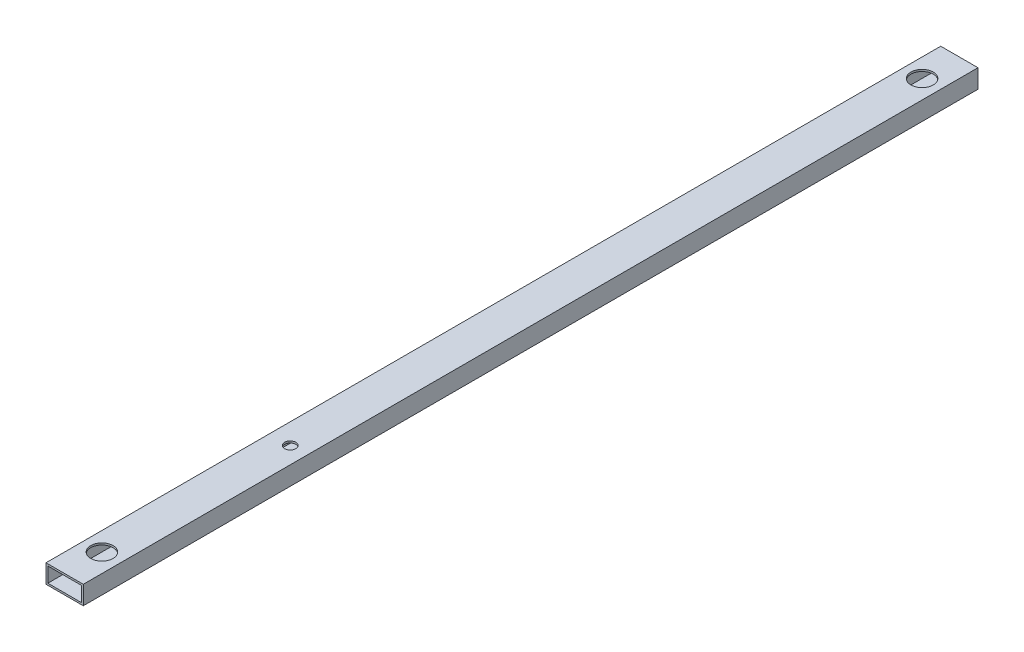
ISO-10303-21;
HEADER;
FILE_DESCRIPTION(('STEP AP214'),'2;1');
FILE_NAME('part.step','',(''),(''),'','','');
FILE_SCHEMA(('AUTOMOTIVE_DESIGN { 1 0 10303 214 1 1 1 1 }'));
ENDSEC;
DATA;
#1=APPLICATION_CONTEXT('core data for automotive mechanical design processes');
#2=APPLICATION_PROTOCOL_DEFINITION('international standard','automotive_design',2000,#1);
#3=PRODUCT_CONTEXT('',#1,'mechanical');
#4=PRODUCT('Part','Part','',(#3));
#5=PRODUCT_RELATED_PRODUCT_CATEGORY('part','',(#4));
#6=PRODUCT_DEFINITION_FORMATION('','',#4);
#7=PRODUCT_DEFINITION_CONTEXT('part definition',#1,'design');
#8=PRODUCT_DEFINITION('design','',#6,#7);
#9=PRODUCT_DEFINITION_SHAPE('','',#8);
#10=(LENGTH_UNIT() NAMED_UNIT(*) SI_UNIT(.MILLI.,.METRE.));
#11=(NAMED_UNIT(*) PLANE_ANGLE_UNIT() SI_UNIT($,.RADIAN.));
#12=(NAMED_UNIT(*) SI_UNIT($,.STERADIAN.) SOLID_ANGLE_UNIT());
#13=UNCERTAINTY_MEASURE_WITH_UNIT(LENGTH_MEASURE(1.E-05),#10,'distance_accuracy_value','');
#14=(GEOMETRIC_REPRESENTATION_CONTEXT(3) GLOBAL_UNCERTAINTY_ASSIGNED_CONTEXT((#13)) GLOBAL_UNIT_ASSIGNED_CONTEXT((#10,
#11,#12)) REPRESENTATION_CONTEXT('',''));
#15=CARTESIAN_POINT('',(0.,0.,0.));
#16=DIRECTION('',(0.,0.,1.));
#17=DIRECTION('',(1.,0.,0.));
#18=AXIS2_PLACEMENT_3D('',#15,#16,#17);
#19=CARTESIAN_POINT('',(-21.7338036512467,14.3817204301075,1200.));
#20=DIRECTION('',(1.,0.,0.));
#21=DIRECTION('',(0.,1.,0.));
#22=AXIS2_PLACEMENT_3D('',#19,#20,#21);
#23=PLANE('',#22);
#24=DIRECTION('',(0.,-1.,0.));
#25=VECTOR('',#24,1.);
#26=CARTESIAN_POINT('',(-21.7338036512467,14.3817204301075,0.));
#27=LINE('',#26,#25);
#28=CARTESIAN_POINT('',(-21.7338036512467,14.3817204301075,0.));
#29=VERTEX_POINT('',#28);
#30=CARTESIAN_POINT('',(-21.7338036512467,-10.6182795698925,0.));
#31=VERTEX_POINT('',#30);
#32=EDGE_CURVE('E144',#29,#31,#27,.T.);
#33=ORIENTED_EDGE('',*,*,#32,.T.);
#34=DIRECTION('',(0.,0.,-1.));
#35=VECTOR('',#34,1.);
#36=CARTESIAN_POINT('',(-21.7338036512467,-10.6182795698925,1200.));
#37=LINE('',#36,#35);
#38=CARTESIAN_POINT('',(-21.7338036512467,-10.6182795698925,1200.));
#39=VERTEX_POINT('',#38);
#40=EDGE_CURVE('E11',#39,#31,#37,.T.);
#41=ORIENTED_EDGE('',*,*,#40,.F.);
#42=DIRECTION('',(0.,-1.,0.));
#43=VECTOR('',#42,1.);
#44=CARTESIAN_POINT('',(-21.7338036512467,14.3817204301075,1200.));
#45=LINE('',#44,#43);
#46=CARTESIAN_POINT('',(-21.7338036512467,14.3817204301075,1200.));
#47=VERTEX_POINT('',#46);
#48=EDGE_CURVE('E133',#47,#39,#45,.T.);
#49=ORIENTED_EDGE('',*,*,#48,.F.);
#50=DIRECTION('',(0.,0.,-1.));
#51=VECTOR('',#50,1.);
#52=CARTESIAN_POINT('',(-21.7338036512467,14.3817204301075,1200.));
#53=LINE('',#52,#51);
#54=EDGE_CURVE('E143',#47,#29,#53,.T.);
#55=ORIENTED_EDGE('',*,*,#54,.T.);
#56=EDGE_LOOP('',(#33,#41,#49,#55));
#57=FACE_BOUND('',#56,.T.);
#58=ADVANCED_FACE('F33',(#57),#23,.F.);
#59=CARTESIAN_POINT('',(-21.7338036512467,-10.6182795698925,1200.));
#60=DIRECTION('',(0.,1.,0.));
#61=DIRECTION('',(0.,0.,1.));
#62=AXIS2_PLACEMENT_3D('',#59,#60,#61);
#63=PLANE('',#62);
#64=CARTESIAN_POINT('',(3.26619634876482,-10.6182795698925,1150.));
#65=DIRECTION('',(0.,1.,0.));
#66=DIRECTION('',(0.,0.,1.));
#67=AXIS2_PLACEMENT_3D('',#64,#65,#66);
#68=CIRCLE('',#67,15.00115);
#69=CARTESIAN_POINT('',(3.26619634876482,-10.6182795698925,1165.00115));
#70=VERTEX_POINT('',#69);
#71=EDGE_CURVE('E264',#70,#70,#68,.T.);
#72=ORIENTED_EDGE('',*,*,#71,.T.);
#73=EDGE_LOOP('',(#72));
#74=FACE_BOUND('',#73,.T.);
#75=CARTESIAN_POINT('',(3.2661963487533,-10.6182795698925,50.));
#76=DIRECTION('',(0.,1.,0.));
#77=DIRECTION('',(0.,0.,1.));
#78=AXIS2_PLACEMENT_3D('',#75,#76,#77);
#79=CIRCLE('',#78,15.00115);
#80=CARTESIAN_POINT('',(3.2661963487533,-10.6182795698925,65.00115));
#81=VERTEX_POINT('',#80);
#82=EDGE_CURVE('E165',#81,#81,#79,.T.);
#83=ORIENTED_EDGE('',*,*,#82,.T.);
#84=EDGE_LOOP('',(#83));
#85=FACE_BOUND('',#84,.T.);
#86=CARTESIAN_POINT('',(5.7661963487533,-10.6182795698925,900.));
#87=DIRECTION('',(0.,1.,0.));
#88=DIRECTION('',(0.,0.,1.));
#89=AXIS2_PLACEMENT_3D('',#86,#87,#88);
#90=CIRCLE('',#89,7.49999999999998);
#91=CARTESIAN_POINT('',(5.7661963487533,-10.6182795698925,907.5));
#92=VERTEX_POINT('',#91);
#93=EDGE_CURVE('E169',#92,#92,#90,.T.);
#94=ORIENTED_EDGE('',*,*,#93,.T.);
#95=EDGE_LOOP('',(#94));
#96=FACE_BOUND('',#95,.T.);
#97=DIRECTION('',(1.,0.,0.));
#98=VECTOR('',#97,1.);
#99=CARTESIAN_POINT('',(-21.7338036512467,-10.6182795698925,0.));
#100=LINE('',#99,#98);
#101=CARTESIAN_POINT('',(28.2661963487533,-10.6182795698925,0.));
#102=VERTEX_POINT('',#101);
#103=EDGE_CURVE('E147',#31,#102,#100,.T.);
#104=ORIENTED_EDGE('',*,*,#103,.T.);
#105=DIRECTION('',(0.,0.,-1.));
#106=VECTOR('',#105,1.);
#107=CARTESIAN_POINT('',(28.2661963487533,-10.6182795698925,1200.));
#108=LINE('',#107,#106);
#109=CARTESIAN_POINT('',(28.2661963487533,-10.6182795698925,1200.));
#110=VERTEX_POINT('',#109);
#111=EDGE_CURVE('E41',#110,#102,#108,.T.);
#112=ORIENTED_EDGE('',*,*,#111,.F.);
#113=DIRECTION('',(1.,0.,0.));
#114=VECTOR('',#113,1.);
#115=CARTESIAN_POINT('',(-21.7338036512467,-10.6182795698925,1200.));
#116=LINE('',#115,#114);
#117=EDGE_CURVE('E136',#39,#110,#116,.T.);
#118=ORIENTED_EDGE('',*,*,#117,.F.);
#119=ORIENTED_EDGE('',*,*,#40,.T.);
#120=EDGE_LOOP('',(#104,#112,#118,#119));
#121=FACE_BOUND('',#120,.T.);
#122=ADVANCED_FACE('F212',(#74,#85,#96,#121),#63,.F.);
#123=CARTESIAN_POINT('',(28.2661963487533,14.3817204301075,1200.));
#124=DIRECTION('',(-1.,0.,0.));
#125=DIRECTION('',(0.,0.,1.));
#126=AXIS2_PLACEMENT_3D('',#123,#124,#125);
#127=PLANE('',#126);
#128=DIRECTION('',(0.,1.,0.));
#129=VECTOR('',#128,1.);
#130=CARTESIAN_POINT('',(28.2661963487533,14.3817204301075,0.));
#131=LINE('',#130,#129);
#132=CARTESIAN_POINT('',(28.2661963487533,14.3817204301075,0.));
#133=VERTEX_POINT('',#132);
#134=EDGE_CURVE('E149',#102,#133,#131,.T.);
#135=ORIENTED_EDGE('',*,*,#134,.T.);
#136=DIRECTION('',(0.,0.,-1.));
#137=VECTOR('',#136,1.);
#138=CARTESIAN_POINT('',(28.2661963487533,14.3817204301075,1200.));
#139=LINE('',#138,#137);
#140=CARTESIAN_POINT('',(28.2661963487533,14.3817204301075,1200.));
#141=VERTEX_POINT('',#140);
#142=EDGE_CURVE('E154',#141,#133,#139,.T.);
#143=ORIENTED_EDGE('',*,*,#142,.F.);
#144=DIRECTION('',(0.,1.,0.));
#145=VECTOR('',#144,1.);
#146=CARTESIAN_POINT('',(28.2661963487533,14.3817204301075,1200.));
#147=LINE('',#146,#145);
#148=EDGE_CURVE('E139',#110,#141,#147,.T.);
#149=ORIENTED_EDGE('',*,*,#148,.F.);
#150=ORIENTED_EDGE('',*,*,#111,.T.);
#151=EDGE_LOOP('',(#135,#143,#149,#150));
#152=FACE_BOUND('',#151,.T.);
#153=ADVANCED_FACE('F218',(#152),#127,.F.);
#154=CARTESIAN_POINT('',(-21.7338036512467,14.3817204301075,1200.));
#155=DIRECTION('',(0.,-1.,0.));
#156=DIRECTION('',(0.,0.,-1.));
#157=AXIS2_PLACEMENT_3D('',#154,#155,#156);
#158=PLANE('',#157);
#159=CARTESIAN_POINT('',(3.26619634876482,14.3817204301075,1150.));
#160=DIRECTION('',(0.,1.,0.));
#161=DIRECTION('',(0.,0.,1.));
#162=AXIS2_PLACEMENT_3D('',#159,#160,#161);
#163=CIRCLE('',#162,15.00115);
#164=CARTESIAN_POINT('',(3.26619634876482,14.3817204301075,1165.00115));
#165=VERTEX_POINT('',#164);
#166=EDGE_CURVE('E267',#165,#165,#163,.T.);
#167=ORIENTED_EDGE('',*,*,#166,.F.);
#168=EDGE_LOOP('',(#167));
#169=FACE_BOUND('',#168,.T.);
#170=CARTESIAN_POINT('',(3.2661963487533,14.3817204301075,50.));
#171=DIRECTION('',(0.,1.,0.));
#172=DIRECTION('',(0.,0.,1.));
#173=AXIS2_PLACEMENT_3D('',#170,#171,#172);
#174=CIRCLE('',#173,15.00115);
#175=CARTESIAN_POINT('',(3.2661963487533,14.3817204301075,65.00115));
#176=VERTEX_POINT('',#175);
#177=EDGE_CURVE('E172',#176,#176,#174,.T.);
#178=ORIENTED_EDGE('',*,*,#177,.F.);
#179=EDGE_LOOP('',(#178));
#180=FACE_BOUND('',#179,.T.);
#181=CARTESIAN_POINT('',(5.7661963487533,14.3817204301075,900.));
#182=DIRECTION('',(0.,1.,0.));
#183=DIRECTION('',(0.,0.,1.));
#184=AXIS2_PLACEMENT_3D('',#181,#182,#183);
#185=CIRCLE('',#184,7.49999999999998);
#186=CARTESIAN_POINT('',(5.7661963487533,14.3817204301075,907.5));
#187=VERTEX_POINT('',#186);
#188=EDGE_CURVE('E161',#187,#187,#185,.T.);
#189=ORIENTED_EDGE('',*,*,#188,.F.);
#190=EDGE_LOOP('',(#189));
#191=FACE_BOUND('',#190,.T.);
#192=DIRECTION('',(-1.,0.,0.));
#193=VECTOR('',#192,1.);
#194=CARTESIAN_POINT('',(-21.7338036512467,14.3817204301075,0.));
#195=LINE('',#194,#193);
#196=EDGE_CURVE('E137',#133,#29,#195,.T.);
#197=ORIENTED_EDGE('',*,*,#196,.T.);
#198=ORIENTED_EDGE('',*,*,#54,.F.);
#199=DIRECTION('',(-1.,0.,0.));
#200=VECTOR('',#199,1.);
#201=CARTESIAN_POINT('',(-21.7338036512467,14.3817204301075,1200.));
#202=LINE('',#201,#200);
#203=EDGE_CURVE('E141',#141,#47,#202,.T.);
#204=ORIENTED_EDGE('',*,*,#203,.F.);
#205=ORIENTED_EDGE('',*,*,#142,.T.);
#206=EDGE_LOOP('',(#197,#198,#204,#205));
#207=FACE_BOUND('',#206,.T.);
#208=ADVANCED_FACE('F232',(#169,#180,#191,#207),#158,.F.);
#209=CARTESIAN_POINT('',(0.,0.,1200.));
#210=DIRECTION('',(0.,0.,1.));
#211=DIRECTION('',(1.,0.,0.));
#212=AXIS2_PLACEMENT_3D('',#209,#210,#211);
#213=PLANE('',#212);
#214=DIRECTION('',(0.,-1.,0.));
#215=VECTOR('',#214,1.);
#216=CARTESIAN_POINT('',(-19.2338036512467,14.3817204301075,1200.));
#217=LINE('',#216,#215);
#218=CARTESIAN_POINT('',(-19.2338036512467,11.8817204301075,1200.));
#219=VERTEX_POINT('',#218);
#220=CARTESIAN_POINT('',(-19.2338036512467,-8.11827956989247,1200.));
#221=VERTEX_POINT('',#220);
#222=EDGE_CURVE('E121',#219,#221,#217,.T.);
#223=ORIENTED_EDGE('',*,*,#222,.F.);
#224=DIRECTION('',(-1.,0.,0.));
#225=VECTOR('',#224,1.);
#226=CARTESIAN_POINT('',(-21.7338036512467,11.8817204301075,1200.));
#227=LINE('',#226,#225);
#228=CARTESIAN_POINT('',(25.7661963487533,11.8817204301075,1200.));
#229=VERTEX_POINT('',#228);
#230=EDGE_CURVE('E104',#229,#219,#227,.T.);
#231=ORIENTED_EDGE('',*,*,#230,.F.);
#232=DIRECTION('',(0.,1.,0.));
#233=VECTOR('',#232,1.);
#234=CARTESIAN_POINT('',(25.7661963487533,14.3817204301075,1200.));
#235=LINE('',#234,#233);
#236=CARTESIAN_POINT('',(25.7661963487533,-8.11827956989247,1200.));
#237=VERTEX_POINT('',#236);
#238=EDGE_CURVE('E130',#237,#229,#235,.T.);
#239=ORIENTED_EDGE('',*,*,#238,.F.);
#240=DIRECTION('',(1.,0.,0.));
#241=VECTOR('',#240,1.);
#242=CARTESIAN_POINT('',(-21.7338036512467,-8.11827956989247,1200.));
#243=LINE('',#242,#241);
#244=EDGE_CURVE('E123',#221,#237,#243,.T.);
#245=ORIENTED_EDGE('',*,*,#244,.F.);
#246=EDGE_LOOP('',(#223,#231,#239,#245));
#247=FACE_BOUND('',#246,.T.);
#248=ORIENTED_EDGE('',*,*,#48,.T.);
#249=ORIENTED_EDGE('',*,*,#117,.T.);
#250=ORIENTED_EDGE('',*,*,#148,.T.);
#251=ORIENTED_EDGE('',*,*,#203,.T.);
#252=EDGE_LOOP('',(#248,#249,#250,#251));
#253=FACE_BOUND('',#252,.T.);
#254=ADVANCED_FACE('F194',(#247,#253),#213,.T.);
#255=CARTESIAN_POINT('',(0.,0.,0.));
#256=DIRECTION('',(0.,0.,1.));
#257=DIRECTION('',(1.,0.,0.));
#258=AXIS2_PLACEMENT_3D('',#255,#256,#257);
#259=PLANE('',#258);
#260=DIRECTION('',(-1.,0.,0.));
#261=VECTOR('',#260,1.);
#262=CARTESIAN_POINT('',(-21.7338036512467,11.8817204301075,0.));
#263=LINE('',#262,#261);
#264=CARTESIAN_POINT('',(25.7661963487533,11.8817204301075,0.));
#265=VERTEX_POINT('',#264);
#266=CARTESIAN_POINT('',(-19.2338036512467,11.8817204301075,0.));
#267=VERTEX_POINT('',#266);
#268=EDGE_CURVE('E102',#265,#267,#263,.T.);
#269=ORIENTED_EDGE('',*,*,#268,.T.);
#270=DIRECTION('',(0.,-1.,0.));
#271=VECTOR('',#270,1.);
#272=CARTESIAN_POINT('',(-19.2338036512467,14.3817204301075,0.));
#273=LINE('',#272,#271);
#274=CARTESIAN_POINT('',(-19.2338036512467,-8.11827956989247,0.));
#275=VERTEX_POINT('',#274);
#276=EDGE_CURVE('E110',#267,#275,#273,.T.);
#277=ORIENTED_EDGE('',*,*,#276,.T.);
#278=DIRECTION('',(1.,0.,0.));
#279=VECTOR('',#278,1.);
#280=CARTESIAN_POINT('',(-21.7338036512467,-8.11827956989247,0.));
#281=LINE('',#280,#279);
#282=CARTESIAN_POINT('',(25.7661963487533,-8.11827956989247,0.));
#283=VERTEX_POINT('',#282);
#284=EDGE_CURVE('E116',#275,#283,#281,.T.);
#285=ORIENTED_EDGE('',*,*,#284,.T.);
#286=DIRECTION('',(0.,1.,0.));
#287=VECTOR('',#286,1.);
#288=CARTESIAN_POINT('',(25.7661963487533,14.3817204301075,0.));
#289=LINE('',#288,#287);
#290=EDGE_CURVE('E56',#283,#265,#289,.T.);
#291=ORIENTED_EDGE('',*,*,#290,.T.);
#292=EDGE_LOOP('',(#269,#277,#285,#291));
#293=FACE_BOUND('',#292,.T.);
#294=ORIENTED_EDGE('',*,*,#32,.F.);
#295=ORIENTED_EDGE('',*,*,#196,.F.);
#296=ORIENTED_EDGE('',*,*,#134,.F.);
#297=ORIENTED_EDGE('',*,*,#103,.F.);
#298=EDGE_LOOP('',(#294,#295,#296,#297));
#299=FACE_BOUND('',#298,.T.);
#300=ADVANCED_FACE('F119',(#293,#299),#259,.F.);
#301=CARTESIAN_POINT('',(-19.2338036512467,14.3817204301075,1200.));
#302=DIRECTION('',(1.,0.,0.));
#303=DIRECTION('',(0.,1.,0.));
#304=AXIS2_PLACEMENT_3D('',#301,#302,#303);
#305=PLANE('',#304);
#306=ORIENTED_EDGE('',*,*,#276,.F.);
#307=DIRECTION('',(0.,0.,-1.));
#308=VECTOR('',#307,1.);
#309=CARTESIAN_POINT('',(-19.2338036512467,11.8817204301075,1200.));
#310=LINE('',#309,#308);
#311=EDGE_CURVE('E98',#219,#267,#310,.T.);
#312=ORIENTED_EDGE('',*,*,#311,.F.);
#313=ORIENTED_EDGE('',*,*,#222,.T.);
#314=DIRECTION('',(0.,0.,-1.));
#315=VECTOR('',#314,1.);
#316=CARTESIAN_POINT('',(-19.2338036512467,-8.11827956989247,1200.));
#317=LINE('',#316,#315);
#318=EDGE_CURVE('E113',#221,#275,#317,.T.);
#319=ORIENTED_EDGE('',*,*,#318,.T.);
#320=EDGE_LOOP('',(#306,#312,#313,#319));
#321=FACE_BOUND('',#320,.T.);
#322=ADVANCED_FACE('F111',(#321),#305,.T.);
#323=CARTESIAN_POINT('',(-21.7338036512467,-8.11827956989247,1200.));
#324=DIRECTION('',(0.,1.,0.));
#325=DIRECTION('',(0.,0.,1.));
#326=AXIS2_PLACEMENT_3D('',#323,#324,#325);
#327=PLANE('',#326);
#328=CARTESIAN_POINT('',(3.26619634876482,-8.11827956989247,1150.));
#329=DIRECTION('',(0.,1.,0.));
#330=DIRECTION('',(0.,0.,1.));
#331=AXIS2_PLACEMENT_3D('',#328,#329,#330);
#332=CIRCLE('',#331,15.00115);
#333=CARTESIAN_POINT('',(3.26619634876482,-8.11827956989247,1165.00115));
#334=VERTEX_POINT('',#333);
#335=EDGE_CURVE('E177',#334,#334,#332,.T.);
#336=ORIENTED_EDGE('',*,*,#335,.F.);
#337=EDGE_LOOP('',(#336));
#338=FACE_BOUND('',#337,.T.);
#339=CARTESIAN_POINT('',(3.2661963487533,-8.11827956989247,50.));
#340=DIRECTION('',(0.,1.,0.));
#341=DIRECTION('',(0.,0.,1.));
#342=AXIS2_PLACEMENT_3D('',#339,#340,#341);
#343=CIRCLE('',#342,15.00115);
#344=CARTESIAN_POINT('',(3.2661963487533,-8.11827956989247,65.00115));
#345=VERTEX_POINT('',#344);
#346=EDGE_CURVE('E164',#345,#345,#343,.T.);
#347=ORIENTED_EDGE('',*,*,#346,.F.);
#348=EDGE_LOOP('',(#347));
#349=FACE_BOUND('',#348,.T.);
#350=CARTESIAN_POINT('',(5.7661963487533,-8.11827956989247,900.));
#351=DIRECTION('',(0.,1.,0.));
#352=DIRECTION('',(0.,0.,1.));
#353=AXIS2_PLACEMENT_3D('',#350,#351,#352);
#354=CIRCLE('',#353,7.49999999999998);
#355=CARTESIAN_POINT('',(5.7661963487533,-8.11827956989247,907.5));
#356=VERTEX_POINT('',#355);
#357=EDGE_CURVE('E117',#356,#356,#354,.F.);
#358=ORIENTED_EDGE('',*,*,#357,.T.);
#359=EDGE_LOOP('',(#358));
#360=FACE_BOUND('',#359,.T.);
#361=ORIENTED_EDGE('',*,*,#284,.F.);
#362=ORIENTED_EDGE('',*,*,#318,.F.);
#363=ORIENTED_EDGE('',*,*,#244,.T.);
#364=DIRECTION('',(0.,0.,-1.));
#365=VECTOR('',#364,1.);
#366=CARTESIAN_POINT('',(25.7661963487533,-8.11827956989247,1200.));
#367=LINE('',#366,#365);
#368=EDGE_CURVE('E188',#237,#283,#367,.T.);
#369=ORIENTED_EDGE('',*,*,#368,.T.);
#370=EDGE_LOOP('',(#361,#362,#363,#369));
#371=FACE_BOUND('',#370,.T.);
#372=ADVANCED_FACE('F197',(#338,#349,#360,#371),#327,.T.);
#373=CARTESIAN_POINT('',(25.7661963487533,14.3817204301075,1200.));
#374=DIRECTION('',(-1.,0.,0.));
#375=DIRECTION('',(0.,0.,1.));
#376=AXIS2_PLACEMENT_3D('',#373,#374,#375);
#377=PLANE('',#376);
#378=ORIENTED_EDGE('',*,*,#290,.F.);
#379=ORIENTED_EDGE('',*,*,#368,.F.);
#380=ORIENTED_EDGE('',*,*,#238,.T.);
#381=DIRECTION('',(0.,0.,-1.));
#382=VECTOR('',#381,1.);
#383=CARTESIAN_POINT('',(25.7661963487533,11.8817204301075,1200.));
#384=LINE('',#383,#382);
#385=EDGE_CURVE('E49',#229,#265,#384,.T.);
#386=ORIENTED_EDGE('',*,*,#385,.T.);
#387=EDGE_LOOP('',(#378,#379,#380,#386));
#388=FACE_BOUND('',#387,.T.);
#389=ADVANCED_FACE('F190',(#388),#377,.T.);
#390=CARTESIAN_POINT('',(-21.7338036512467,11.8817204301075,1200.));
#391=DIRECTION('',(0.,-1.,0.));
#392=DIRECTION('',(0.,0.,-1.));
#393=AXIS2_PLACEMENT_3D('',#390,#391,#392);
#394=PLANE('',#393);
#395=CARTESIAN_POINT('',(3.26619634876482,11.8817204301075,1150.));
#396=DIRECTION('',(0.,-1.,0.));
#397=DIRECTION('',(0.,0.,-1.));
#398=AXIS2_PLACEMENT_3D('',#395,#396,#397);
#399=CIRCLE('',#398,15.00115);
#400=CARTESIAN_POINT('',(3.26619634876482,11.8817204301075,1134.99885));
#401=VERTEX_POINT('',#400);
#402=EDGE_CURVE('E36',#401,#401,#399,.T.);
#403=ORIENTED_EDGE('',*,*,#402,.F.);
#404=EDGE_LOOP('',(#403));
#405=FACE_BOUND('',#404,.T.);
#406=CARTESIAN_POINT('',(3.2661963487533,11.8817204301075,50.));
#407=DIRECTION('',(0.,-1.,0.));
#408=DIRECTION('',(0.,0.,-1.));
#409=AXIS2_PLACEMENT_3D('',#406,#407,#408);
#410=CIRCLE('',#409,15.00115);
#411=CARTESIAN_POINT('',(3.2661963487533,11.8817204301075,34.99885));
#412=VERTEX_POINT('',#411);
#413=EDGE_CURVE('E162',#412,#412,#410,.T.);
#414=ORIENTED_EDGE('',*,*,#413,.F.);
#415=EDGE_LOOP('',(#414));
#416=FACE_BOUND('',#415,.T.);
#417=CARTESIAN_POINT('',(5.7661963487533,11.8817204301075,900.));
#418=DIRECTION('',(0.,-1.,0.));
#419=DIRECTION('',(0.,0.,-1.));
#420=AXIS2_PLACEMENT_3D('',#417,#418,#419);
#421=CIRCLE('',#420,7.49999999999998);
#422=CARTESIAN_POINT('',(5.7661963487533,11.8817204301075,892.5));
#423=VERTEX_POINT('',#422);
#424=EDGE_CURVE('E159',#423,#423,#421,.F.);
#425=ORIENTED_EDGE('',*,*,#424,.T.);
#426=EDGE_LOOP('',(#425));
#427=FACE_BOUND('',#426,.T.);
#428=ORIENTED_EDGE('',*,*,#268,.F.);
#429=ORIENTED_EDGE('',*,*,#385,.F.);
#430=ORIENTED_EDGE('',*,*,#230,.T.);
#431=ORIENTED_EDGE('',*,*,#311,.T.);
#432=EDGE_LOOP('',(#428,#429,#430,#431));
#433=FACE_BOUND('',#432,.T.);
#434=ADVANCED_FACE('F100',(#405,#416,#427,#433),#394,.T.);
#435=CARTESIAN_POINT('',(5.7661963487533,14.3817204301075,900.));
#436=DIRECTION('',(0.,-1.,0.));
#437=DIRECTION('',(0.,0.,-1.));
#438=AXIS2_PLACEMENT_3D('',#435,#436,#437);
#439=CYLINDRICAL_SURFACE('',#438,7.49999999999998);
#440=ORIENTED_EDGE('',*,*,#424,.F.);
#441=EDGE_LOOP('',(#440));
#442=FACE_BOUND('',#441,.T.);
#443=ORIENTED_EDGE('',*,*,#188,.T.);
#444=EDGE_LOOP('',(#443));
#445=FACE_BOUND('',#444,.T.);
#446=ADVANCED_FACE('F246',(#442,#445),#439,.F.);
#447=ORIENTED_EDGE('',*,*,#357,.F.);
#448=EDGE_LOOP('',(#447));
#449=FACE_BOUND('',#448,.T.);
#450=ORIENTED_EDGE('',*,*,#93,.F.);
#451=EDGE_LOOP('',(#450));
#452=FACE_BOUND('',#451,.T.);
#453=ADVANCED_FACE('F252',(#449,#452),#439,.F.);
#454=CARTESIAN_POINT('',(3.2661963487533,-10.6182795698925,50.));
#455=DIRECTION('',(0.,1.,0.));
#456=DIRECTION('',(0.,0.,1.));
#457=AXIS2_PLACEMENT_3D('',#454,#455,#456);
#458=CYLINDRICAL_SURFACE('',#457,15.00115);
#459=ORIENTED_EDGE('',*,*,#413,.T.);
#460=EDGE_LOOP('',(#459));
#461=FACE_BOUND('',#460,.T.);
#462=ORIENTED_EDGE('',*,*,#177,.T.);
#463=EDGE_LOOP('',(#462));
#464=FACE_BOUND('',#463,.T.);
#465=ADVANCED_FACE('F277',(#461,#464),#458,.F.);
#466=ORIENTED_EDGE('',*,*,#346,.T.);
#467=EDGE_LOOP('',(#466));
#468=FACE_BOUND('',#467,.T.);
#469=ORIENTED_EDGE('',*,*,#82,.F.);
#470=EDGE_LOOP('',(#469));
#471=FACE_BOUND('',#470,.T.);
#472=ADVANCED_FACE('F279',(#468,#471),#458,.F.);
#473=CARTESIAN_POINT('',(3.26619634876482,-10.6182795698925,1150.));
#474=DIRECTION('',(0.,1.,0.));
#475=DIRECTION('',(0.,0.,1.));
#476=AXIS2_PLACEMENT_3D('',#473,#474,#475);
#477=CYLINDRICAL_SURFACE('',#476,15.00115);
#478=ORIENTED_EDGE('',*,*,#402,.T.);
#479=EDGE_LOOP('',(#478));
#480=FACE_BOUND('',#479,.T.);
#481=ORIENTED_EDGE('',*,*,#166,.T.);
#482=EDGE_LOOP('',(#481));
#483=FACE_BOUND('',#482,.T.);
#484=ADVANCED_FACE('F273',(#480,#483),#477,.F.);
#485=ORIENTED_EDGE('',*,*,#335,.T.);
#486=EDGE_LOOP('',(#485));
#487=FACE_BOUND('',#486,.T.);
#488=ORIENTED_EDGE('',*,*,#71,.F.);
#489=EDGE_LOOP('',(#488));
#490=FACE_BOUND('',#489,.T.);
#491=ADVANCED_FACE('F288',(#487,#490),#477,.F.);
#492=CLOSED_SHELL('',(#58,#122,#153,#208,#254,#300,#322,#372,#389,#434,#446,#453,#465,#472,#484,#491));
#493=MANIFOLD_SOLID_BREP('B2',#492);
#494=ADVANCED_BREP_SHAPE_REPRESENTATION('',(#18,#493),#14);
#495=SHAPE_DEFINITION_REPRESENTATION(#9,#494);
ENDSEC;
END-ISO-10303-21;
